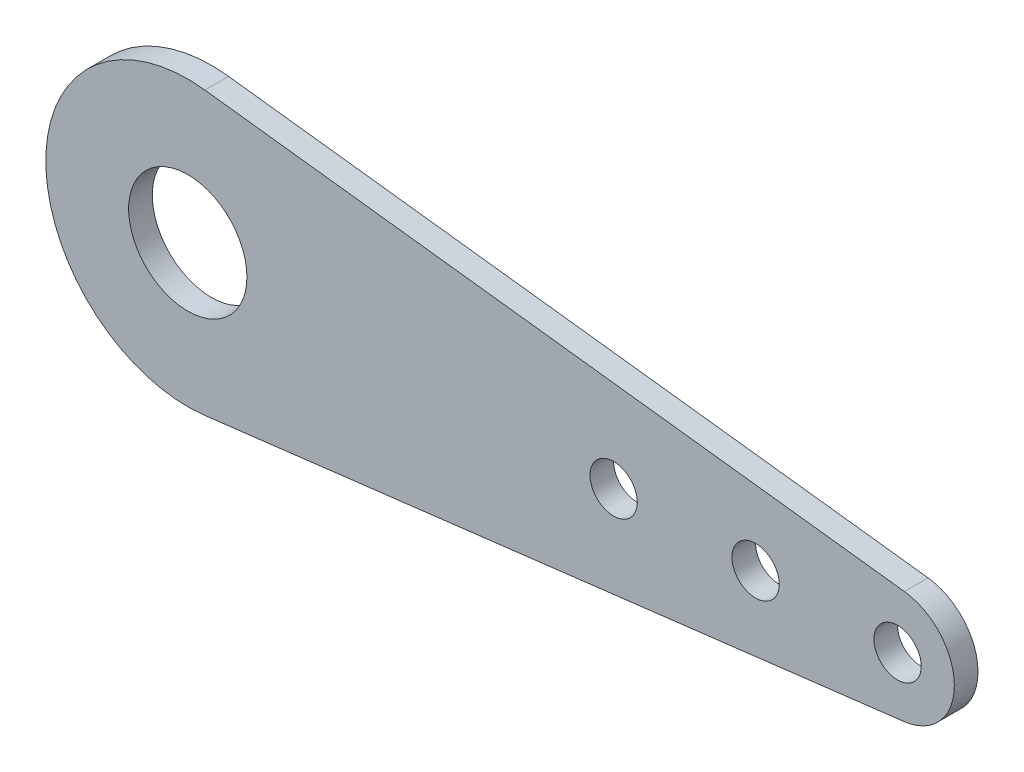
ISO-10303-21;
HEADER;
FILE_DESCRIPTION(('STEP AP214'),'2;1');
FILE_NAME('part.step','',(''),(''),'','','');
FILE_SCHEMA(('AUTOMOTIVE_DESIGN { 1 0 10303 214 1 1 1 1 }'));
ENDSEC;
DATA;
#1=APPLICATION_CONTEXT('core data for automotive mechanical design processes');
#2=APPLICATION_PROTOCOL_DEFINITION('international standard','automotive_design',2000,#1);
#3=PRODUCT_CONTEXT('',#1,'mechanical');
#4=PRODUCT('Part','Part','',(#3));
#5=PRODUCT_RELATED_PRODUCT_CATEGORY('part','',(#4));
#6=PRODUCT_DEFINITION_FORMATION('','',#4);
#7=PRODUCT_DEFINITION_CONTEXT('part definition',#1,'design');
#8=PRODUCT_DEFINITION('design','',#6,#7);
#9=PRODUCT_DEFINITION_SHAPE('','',#8);
#10=(LENGTH_UNIT() NAMED_UNIT(*) SI_UNIT(.MILLI.,.METRE.));
#11=(NAMED_UNIT(*) PLANE_ANGLE_UNIT() SI_UNIT($,.RADIAN.));
#12=(NAMED_UNIT(*) SI_UNIT($,.STERADIAN.) SOLID_ANGLE_UNIT());
#13=UNCERTAINTY_MEASURE_WITH_UNIT(LENGTH_MEASURE(1.E-05),#10,'distance_accuracy_value','');
#14=(GEOMETRIC_REPRESENTATION_CONTEXT(3) GLOBAL_UNCERTAINTY_ASSIGNED_CONTEXT((#13)) GLOBAL_UNIT_ASSIGNED_CONTEXT((#10,
#11,#12)) REPRESENTATION_CONTEXT('',''));
#15=CARTESIAN_POINT('',(0.,0.,0.));
#16=DIRECTION('',(0.,0.,1.));
#17=DIRECTION('',(1.,0.,0.));
#18=AXIS2_PLACEMENT_3D('',#15,#16,#17);
#19=CARTESIAN_POINT('',(0.,0.,-1.5875));
#20=DIRECTION('',(0.,0.,1.));
#21=DIRECTION('',(1.,0.,0.));
#22=AXIS2_PLACEMENT_3D('',#19,#20,#21);
#23=CYLINDRICAL_SURFACE('',#22,19.05);
#24=DIRECTION('',(0.,0.,1.));
#25=VECTOR('',#24,1.);
#26=CARTESIAN_POINT('',(2.286,-18.9123426364901,-1.5875));
#27=LINE('',#26,#25);
#28=CARTESIAN_POINT('',(2.286,-18.9123426364901,-1.5875));
#29=VERTEX_POINT('',#28);
#30=CARTESIAN_POINT('',(2.286,-18.9123426364901,1.5875));
#31=VERTEX_POINT('',#30);
#32=EDGE_CURVE('E51',#29,#31,#27,.T.);
#33=ORIENTED_EDGE('',*,*,#32,.T.);
#34=CARTESIAN_POINT('',(0.,0.,1.5875));
#35=DIRECTION('',(0.,0.,1.));
#36=DIRECTION('',(1.,0.,0.));
#37=AXIS2_PLACEMENT_3D('',#34,#35,#36);
#38=CIRCLE('',#37,19.05);
#39=CARTESIAN_POINT('',(2.286,18.9123426364901,1.5875));
#40=VERTEX_POINT('',#39);
#41=EDGE_CURVE('E90',#40,#31,#38,.T.);
#42=ORIENTED_EDGE('',*,*,#41,.F.);
#43=DIRECTION('',(0.,0.,1.));
#44=VECTOR('',#43,1.);
#45=CARTESIAN_POINT('',(2.286,18.9123426364901,-1.5875));
#46=LINE('',#45,#44);
#47=CARTESIAN_POINT('',(2.286,18.9123426364901,-1.5875));
#48=VERTEX_POINT('',#47);
#49=EDGE_CURVE('E11',#48,#40,#46,.T.);
#50=ORIENTED_EDGE('',*,*,#49,.F.);
#51=CARTESIAN_POINT('',(0.,0.,-1.5875));
#52=DIRECTION('',(0.,0.,1.));
#53=DIRECTION('',(1.,0.,0.));
#54=AXIS2_PLACEMENT_3D('',#51,#52,#53);
#55=CIRCLE('',#54,19.05);
#56=EDGE_CURVE('E92',#48,#29,#55,.T.);
#57=ORIENTED_EDGE('',*,*,#56,.T.);
#58=EDGE_LOOP('',(#33,#42,#50,#57));
#59=FACE_BOUND('',#58,.T.);
#60=ADVANCED_FACE('F47',(#59),#23,.T.);
#61=CARTESIAN_POINT('',(2.28600000000001,18.9123426364901,-1.5875));
#62=DIRECTION('',(-0.12,-0.992773891679268,0.));
#63=DIRECTION('',(0.992773891679269,-0.12,0.));
#64=AXIS2_PLACEMENT_3D('',#61,#62,#63);
#65=PLANE('',#64);
#66=ORIENTED_EDGE('',*,*,#49,.T.);
#67=DIRECTION('',(0.992773891679269,-0.12,0.));
#68=VECTOR('',#67,1.);
#69=CARTESIAN_POINT('',(2.28600000000001,18.9123426364901,1.5875));
#70=LINE('',#69,#68);
#71=CARTESIAN_POINT('',(96.1644,7.56493705459603,1.5875));
#72=VERTEX_POINT('',#71);
#73=EDGE_CURVE('E109',#40,#72,#70,.T.);
#74=ORIENTED_EDGE('',*,*,#73,.T.);
#75=DIRECTION('',(0.,0.,1.));
#76=VECTOR('',#75,1.);
#77=CARTESIAN_POINT('',(96.1644,7.56493705459603,-1.5875));
#78=LINE('',#77,#76);
#79=CARTESIAN_POINT('',(96.1644,7.56493705459603,-1.5875));
#80=VERTEX_POINT('',#79);
#81=EDGE_CURVE('E57',#80,#72,#78,.T.);
#82=ORIENTED_EDGE('',*,*,#81,.F.);
#83=DIRECTION('',(0.992773891679269,-0.12,0.));
#84=VECTOR('',#83,1.);
#85=CARTESIAN_POINT('',(2.28600000000001,18.9123426364901,-1.5875));
#86=LINE('',#85,#84);
#87=EDGE_CURVE('E70',#48,#80,#86,.T.);
#88=ORIENTED_EDGE('',*,*,#87,.F.);
#89=EDGE_LOOP('',(#66,#74,#82,#88));
#90=FACE_BOUND('',#89,.T.);
#91=ADVANCED_FACE('F143',(#90),#65,.F.);
#92=CARTESIAN_POINT('',(95.25,0.,-1.5875));
#93=DIRECTION('',(0.,0.,1.));
#94=DIRECTION('',(1.,0.,0.));
#95=AXIS2_PLACEMENT_3D('',#92,#93,#94);
#96=CYLINDRICAL_SURFACE('',#95,7.62);
#97=ORIENTED_EDGE('',*,*,#81,.T.);
#98=CARTESIAN_POINT('',(95.25,0.,1.5875));
#99=DIRECTION('',(0.,0.,1.));
#100=DIRECTION('',(1.,0.,0.));
#101=AXIS2_PLACEMENT_3D('',#98,#99,#100);
#102=CIRCLE('',#101,7.62);
#103=CARTESIAN_POINT('',(96.1644,-7.56493705459603,1.5875));
#104=VERTEX_POINT('',#103);
#105=EDGE_CURVE('E105',#104,#72,#102,.T.);
#106=ORIENTED_EDGE('',*,*,#105,.F.);
#107=DIRECTION('',(0.,0.,1.));
#108=VECTOR('',#107,1.);
#109=CARTESIAN_POINT('',(96.1644,-7.56493705459603,-1.5875));
#110=LINE('',#109,#108);
#111=CARTESIAN_POINT('',(96.1644,-7.56493705459603,-1.5875));
#112=VERTEX_POINT('',#111);
#113=EDGE_CURVE('E97',#112,#104,#110,.T.);
#114=ORIENTED_EDGE('',*,*,#113,.F.);
#115=CARTESIAN_POINT('',(95.25,0.,-1.5875));
#116=DIRECTION('',(0.,0.,1.));
#117=DIRECTION('',(1.,0.,0.));
#118=AXIS2_PLACEMENT_3D('',#115,#116,#117);
#119=CIRCLE('',#118,7.62);
#120=EDGE_CURVE('E132',#112,#80,#119,.T.);
#121=ORIENTED_EDGE('',*,*,#120,.T.);
#122=EDGE_LOOP('',(#97,#106,#114,#121));
#123=FACE_BOUND('',#122,.T.);
#124=ADVANCED_FACE('F141',(#123),#96,.T.);
#125=CARTESIAN_POINT('',(0.,0.,-1.5875));
#126=DIRECTION('',(0.,0.,1.));
#127=DIRECTION('',(1.,0.,0.));
#128=AXIS2_PLACEMENT_3D('',#125,#126,#127);
#129=CYLINDRICAL_SURFACE('',#128,7.9375);
#130=CARTESIAN_POINT('',(0.,0.,-1.5875));
#131=DIRECTION('',(0.,0.,1.));
#132=DIRECTION('',(1.,0.,0.));
#133=AXIS2_PLACEMENT_3D('',#130,#131,#132);
#134=CIRCLE('',#133,7.9375);
#135=CARTESIAN_POINT('',(7.9375,0.,-1.5875));
#136=VERTEX_POINT('',#135);
#137=EDGE_CURVE('E123',#136,#136,#134,.T.);
#138=ORIENTED_EDGE('',*,*,#137,.F.);
#139=EDGE_LOOP('',(#138));
#140=FACE_BOUND('',#139,.T.);
#141=CARTESIAN_POINT('',(0.,0.,1.5875));
#142=DIRECTION('',(0.,0.,1.));
#143=DIRECTION('',(1.,0.,0.));
#144=AXIS2_PLACEMENT_3D('',#141,#142,#143);
#145=CIRCLE('',#144,7.9375);
#146=CARTESIAN_POINT('',(7.9375,0.,1.5875));
#147=VERTEX_POINT('',#146);
#148=EDGE_CURVE('E111',#147,#147,#145,.T.);
#149=ORIENTED_EDGE('',*,*,#148,.T.);
#150=EDGE_LOOP('',(#149));
#151=FACE_BOUND('',#150,.T.);
#152=ADVANCED_FACE('F49',(#140,#151),#129,.F.);
#153=CARTESIAN_POINT('',(2.28600000000001,-18.9123426364901,-1.5875));
#154=DIRECTION('',(0.12,-0.992773891679268,0.));
#155=DIRECTION('',(0.992773891679269,0.12,0.));
#156=AXIS2_PLACEMENT_3D('',#153,#154,#155);
#157=PLANE('',#156);
#158=ORIENTED_EDGE('',*,*,#113,.T.);
#159=DIRECTION('',(0.992773891679269,0.12,0.));
#160=VECTOR('',#159,1.);
#161=CARTESIAN_POINT('',(2.28600000000001,-18.9123426364901,1.5875));
#162=LINE('',#161,#160);
#163=EDGE_CURVE('E99',#31,#104,#162,.T.);
#164=ORIENTED_EDGE('',*,*,#163,.F.);
#165=ORIENTED_EDGE('',*,*,#32,.F.);
#166=DIRECTION('',(0.992773891679269,0.12,0.));
#167=VECTOR('',#166,1.);
#168=CARTESIAN_POINT('',(2.28600000000001,-18.9123426364901,-1.5875));
#169=LINE('',#168,#167);
#170=EDGE_CURVE('E129',#29,#112,#169,.T.);
#171=ORIENTED_EDGE('',*,*,#170,.T.);
#172=EDGE_LOOP('',(#158,#164,#165,#171));
#173=FACE_BOUND('',#172,.T.);
#174=ADVANCED_FACE('F100',(#173),#157,.T.);
#175=CARTESIAN_POINT('',(0.,0.,-1.5875));
#176=DIRECTION('',(0.,0.,1.));
#177=DIRECTION('',(1.,0.,0.));
#178=AXIS2_PLACEMENT_3D('',#175,#176,#177);
#179=PLANE('',#178);
#180=CARTESIAN_POINT('',(57.15,0.,-1.5875));
#181=DIRECTION('',(0.,0.,1.));
#182=DIRECTION('',(1.,0.,0.));
#183=AXIS2_PLACEMENT_3D('',#180,#181,#182);
#184=CIRCLE('',#183,3.175);
#185=CARTESIAN_POINT('',(60.325,0.,-1.5875));
#186=VERTEX_POINT('',#185);
#187=EDGE_CURVE('E252',#186,#186,#184,.T.);
#188=ORIENTED_EDGE('',*,*,#187,.T.);
#189=EDGE_LOOP('',(#188));
#190=FACE_BOUND('',#189,.T.);
#191=CARTESIAN_POINT('',(76.2,0.,-1.5875));
#192=DIRECTION('',(0.,0.,1.));
#193=DIRECTION('',(1.,0.,0.));
#194=AXIS2_PLACEMENT_3D('',#191,#192,#193);
#195=CIRCLE('',#194,3.175);
#196=CARTESIAN_POINT('',(79.375,0.,-1.5875));
#197=VERTEX_POINT('',#196);
#198=EDGE_CURVE('E260',#197,#197,#195,.T.);
#199=ORIENTED_EDGE('',*,*,#198,.T.);
#200=EDGE_LOOP('',(#199));
#201=FACE_BOUND('',#200,.T.);
#202=CARTESIAN_POINT('',(95.25,0.,-1.5875));
#203=DIRECTION('',(0.,0.,1.));
#204=DIRECTION('',(1.,0.,0.));
#205=AXIS2_PLACEMENT_3D('',#202,#203,#204);
#206=CIRCLE('',#205,3.175);
#207=CARTESIAN_POINT('',(98.425,0.,-1.5875));
#208=VERTEX_POINT('',#207);
#209=EDGE_CURVE('E267',#208,#208,#206,.T.);
#210=ORIENTED_EDGE('',*,*,#209,.T.);
#211=EDGE_LOOP('',(#210));
#212=FACE_BOUND('',#211,.T.);
#213=ORIENTED_EDGE('',*,*,#137,.T.);
#214=EDGE_LOOP('',(#213));
#215=FACE_BOUND('',#214,.T.);
#216=ORIENTED_EDGE('',*,*,#56,.F.);
#217=ORIENTED_EDGE('',*,*,#87,.T.);
#218=ORIENTED_EDGE('',*,*,#120,.F.);
#219=ORIENTED_EDGE('',*,*,#170,.F.);
#220=EDGE_LOOP('',(#216,#217,#218,#219));
#221=FACE_BOUND('',#220,.T.);
#222=ADVANCED_FACE('F144',(#190,#201,#212,#215,#221),#179,.F.);
#223=CARTESIAN_POINT('',(0.,0.,1.5875));
#224=DIRECTION('',(0.,0.,1.));
#225=DIRECTION('',(1.,0.,0.));
#226=AXIS2_PLACEMENT_3D('',#223,#224,#225);
#227=PLANE('',#226);
#228=CARTESIAN_POINT('',(57.15,0.,1.5875));
#229=DIRECTION('',(0.,0.,1.));
#230=DIRECTION('',(1.,0.,0.));
#231=AXIS2_PLACEMENT_3D('',#228,#229,#230);
#232=CIRCLE('',#231,3.175);
#233=CARTESIAN_POINT('',(60.325,0.,1.5875));
#234=VERTEX_POINT('',#233);
#235=EDGE_CURVE('E115',#234,#234,#232,.T.);
#236=ORIENTED_EDGE('',*,*,#235,.F.);
#237=EDGE_LOOP('',(#236));
#238=FACE_BOUND('',#237,.T.);
#239=CARTESIAN_POINT('',(76.2,0.,1.5875));
#240=DIRECTION('',(0.,0.,1.));
#241=DIRECTION('',(1.,0.,0.));
#242=AXIS2_PLACEMENT_3D('',#239,#240,#241);
#243=CIRCLE('',#242,3.175);
#244=CARTESIAN_POINT('',(79.375,0.,1.5875));
#245=VERTEX_POINT('',#244);
#246=EDGE_CURVE('E254',#245,#245,#243,.T.);
#247=ORIENTED_EDGE('',*,*,#246,.F.);
#248=EDGE_LOOP('',(#247));
#249=FACE_BOUND('',#248,.T.);
#250=CARTESIAN_POINT('',(95.25,0.,1.5875));
#251=DIRECTION('',(0.,0.,1.));
#252=DIRECTION('',(1.,0.,0.));
#253=AXIS2_PLACEMENT_3D('',#250,#251,#252);
#254=CIRCLE('',#253,3.175);
#255=CARTESIAN_POINT('',(98.425,0.,1.5875));
#256=VERTEX_POINT('',#255);
#257=EDGE_CURVE('E265',#256,#256,#254,.T.);
#258=ORIENTED_EDGE('',*,*,#257,.F.);
#259=EDGE_LOOP('',(#258));
#260=FACE_BOUND('',#259,.T.);
#261=ORIENTED_EDGE('',*,*,#148,.F.);
#262=EDGE_LOOP('',(#261));
#263=FACE_BOUND('',#262,.T.);
#264=ORIENTED_EDGE('',*,*,#41,.T.);
#265=ORIENTED_EDGE('',*,*,#163,.T.);
#266=ORIENTED_EDGE('',*,*,#105,.T.);
#267=ORIENTED_EDGE('',*,*,#73,.F.);
#268=EDGE_LOOP('',(#264,#265,#266,#267));
#269=FACE_BOUND('',#268,.T.);
#270=ADVANCED_FACE('F107',(#238,#249,#260,#263,#269),#227,.T.);
#271=CARTESIAN_POINT('',(95.25,0.,1.5875));
#272=DIRECTION('',(0.,0.,-1.));
#273=DIRECTION('',(-1.,0.,0.));
#274=AXIS2_PLACEMENT_3D('',#271,#272,#273);
#275=CYLINDRICAL_SURFACE('',#274,3.175);
#276=ORIENTED_EDGE('',*,*,#257,.T.);
#277=EDGE_LOOP('',(#276));
#278=FACE_BOUND('',#277,.T.);
#279=ORIENTED_EDGE('',*,*,#209,.F.);
#280=EDGE_LOOP('',(#279));
#281=FACE_BOUND('',#280,.T.);
#282=ADVANCED_FACE('F152',(#278,#281),#275,.F.);
#283=CARTESIAN_POINT('',(76.2,0.,1.5875));
#284=DIRECTION('',(0.,0.,-1.));
#285=DIRECTION('',(-1.,0.,0.));
#286=AXIS2_PLACEMENT_3D('',#283,#284,#285);
#287=CYLINDRICAL_SURFACE('',#286,3.175);
#288=ORIENTED_EDGE('',*,*,#246,.T.);
#289=EDGE_LOOP('',(#288));
#290=FACE_BOUND('',#289,.T.);
#291=ORIENTED_EDGE('',*,*,#198,.F.);
#292=EDGE_LOOP('',(#291));
#293=FACE_BOUND('',#292,.T.);
#294=ADVANCED_FACE('F225',(#290,#293),#287,.F.);
#295=CARTESIAN_POINT('',(57.15,0.,1.5875));
#296=DIRECTION('',(0.,0.,-1.));
#297=DIRECTION('',(-1.,0.,0.));
#298=AXIS2_PLACEMENT_3D('',#295,#296,#297);
#299=CYLINDRICAL_SURFACE('',#298,3.175);
#300=ORIENTED_EDGE('',*,*,#235,.T.);
#301=EDGE_LOOP('',(#300));
#302=FACE_BOUND('',#301,.T.);
#303=ORIENTED_EDGE('',*,*,#187,.F.);
#304=EDGE_LOOP('',(#303));
#305=FACE_BOUND('',#304,.T.);
#306=ADVANCED_FACE('F235',(#302,#305),#299,.F.);
#307=CLOSED_SHELL('',(#60,#91,#124,#152,#174,#222,#270,#282,#294,#306));
#308=MANIFOLD_SOLID_BREP('B2',#307);
#309=ADVANCED_BREP_SHAPE_REPRESENTATION('',(#18,#308),#14);
#310=SHAPE_DEFINITION_REPRESENTATION(#9,#309);
ENDSEC;
END-ISO-10303-21;
